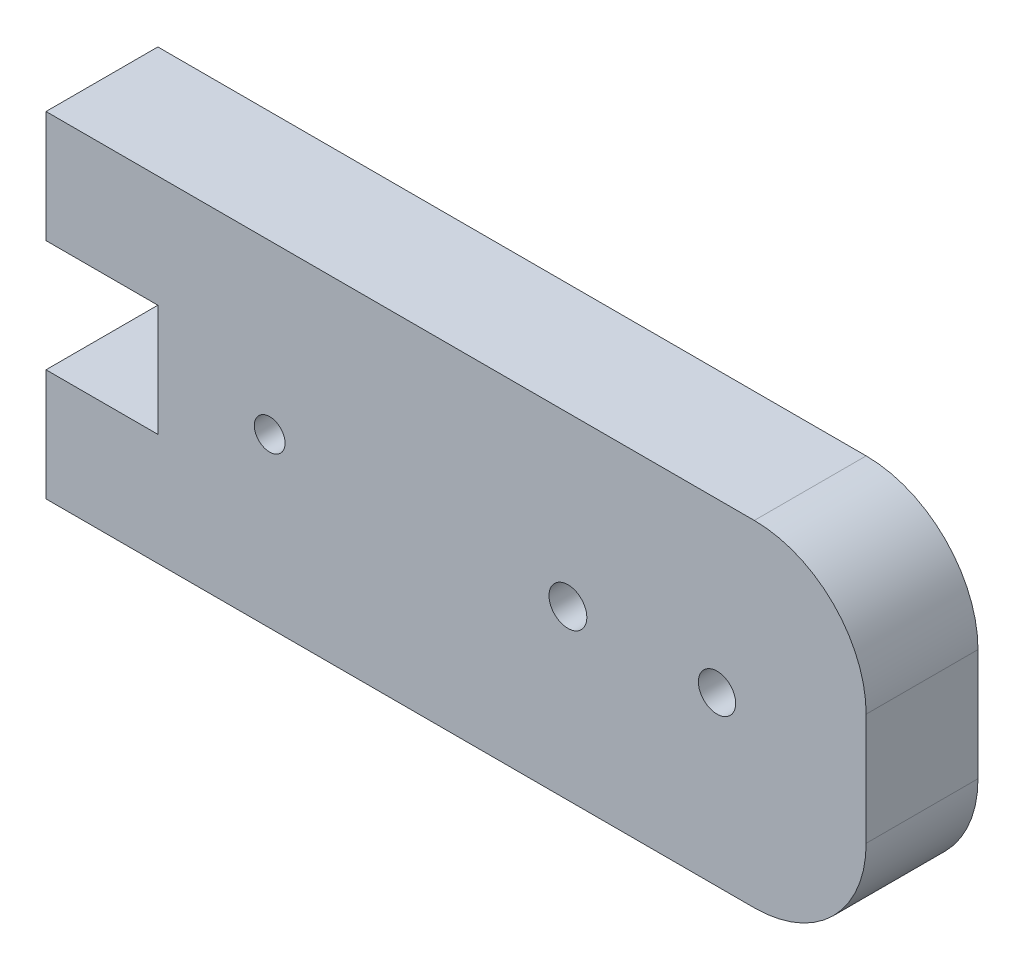
ISO-10303-21;
HEADER;
FILE_DESCRIPTION(('STEP AP214'),'2;1');
FILE_NAME('part.step','',(''),(''),'','','');
FILE_SCHEMA(('AUTOMOTIVE_DESIGN { 1 0 10303 214 1 1 1 1 }'));
ENDSEC;
DATA;
#1=APPLICATION_CONTEXT('core data for automotive mechanical design processes');
#2=APPLICATION_PROTOCOL_DEFINITION('international standard','automotive_design',2000,#1);
#3=PRODUCT_CONTEXT('',#1,'mechanical');
#4=PRODUCT('Part','Part','',(#3));
#5=PRODUCT_RELATED_PRODUCT_CATEGORY('part','',(#4));
#6=PRODUCT_DEFINITION_FORMATION('','',#4);
#7=PRODUCT_DEFINITION_CONTEXT('part definition',#1,'design');
#8=PRODUCT_DEFINITION('design','',#6,#7);
#9=PRODUCT_DEFINITION_SHAPE('','',#8);
#10=(LENGTH_UNIT() NAMED_UNIT(*) SI_UNIT(.MILLI.,.METRE.));
#11=(NAMED_UNIT(*) PLANE_ANGLE_UNIT() SI_UNIT($,.RADIAN.));
#12=(NAMED_UNIT(*) SI_UNIT($,.STERADIAN.) SOLID_ANGLE_UNIT());
#13=UNCERTAINTY_MEASURE_WITH_UNIT(LENGTH_MEASURE(1.E-05),#10,'distance_accuracy_value','');
#14=(GEOMETRIC_REPRESENTATION_CONTEXT(3) GLOBAL_UNCERTAINTY_ASSIGNED_CONTEXT((#13)) GLOBAL_UNIT_ASSIGNED_CONTEXT((#10,
#11,#12)) REPRESENTATION_CONTEXT('',''));
#15=CARTESIAN_POINT('',(0.,0.,0.));
#16=DIRECTION('',(0.,0.,1.));
#17=DIRECTION('',(1.,0.,0.));
#18=AXIS2_PLACEMENT_3D('',#15,#16,#17);
#19=CARTESIAN_POINT('',(0.,0.,3.));
#20=DIRECTION('',(0.,0.,1.));
#21=DIRECTION('',(1.,0.,0.));
#22=AXIS2_PLACEMENT_3D('',#19,#20,#21);
#23=PLANE('',#22);
#24=CARTESIAN_POINT('',(-5.,0.,3.));
#25=DIRECTION('',(0.,0.,1.));
#26=DIRECTION('',(1.,0.,0.));
#27=AXIS2_PLACEMENT_3D('',#24,#25,#26);
#28=CIRCLE('',#27,0.412242994607637);
#29=CARTESIAN_POINT('',(-4.58775700539236,0.,3.));
#30=VERTEX_POINT('',#29);
#31=EDGE_CURVE('E363',#30,#30,#28,.T.);
#32=ORIENTED_EDGE('',*,*,#31,.F.);
#33=EDGE_LOOP('',(#32));
#34=FACE_BOUND('',#33,.T.);
#35=DIRECTION('',(1.,0.,0.));
#36=VECTOR('',#35,1.);
#37=CARTESIAN_POINT('',(-11.,-4.5,3.));
#38=LINE('',#37,#36);
#39=CARTESIAN_POINT('',(-11.,-4.5,3.));
#40=VERTEX_POINT('',#39);
#41=CARTESIAN_POINT('',(8.,-4.5,3.));
#42=VERTEX_POINT('',#41);
#43=EDGE_CURVE('E144',#40,#42,#38,.T.);
#44=ORIENTED_EDGE('',*,*,#43,.T.);
#45=CARTESIAN_POINT('',(8.,-1.5,3.));
#46=DIRECTION('',(0.,0.,1.));
#47=DIRECTION('',(1.,0.,0.));
#48=AXIS2_PLACEMENT_3D('',#45,#46,#47);
#49=CIRCLE('',#48,3.);
#50=CARTESIAN_POINT('',(11.,-1.5,3.));
#51=VERTEX_POINT('',#50);
#52=EDGE_CURVE('E41',#42,#51,#49,.T.);
#53=ORIENTED_EDGE('',*,*,#52,.T.);
#54=DIRECTION('',(0.,1.,0.));
#55=VECTOR('',#54,1.);
#56=CARTESIAN_POINT('',(11.,-0.499999999999999,3.));
#57=LINE('',#56,#55);
#58=CARTESIAN_POINT('',(11.,1.5,3.));
#59=VERTEX_POINT('',#58);
#60=EDGE_CURVE('E118',#51,#59,#57,.T.);
#61=ORIENTED_EDGE('',*,*,#60,.T.);
#62=CARTESIAN_POINT('',(8.,1.5,3.));
#63=DIRECTION('',(0.,0.,1.));
#64=DIRECTION('',(1.,0.,0.));
#65=AXIS2_PLACEMENT_3D('',#62,#63,#64);
#66=CIRCLE('',#65,3.);
#67=CARTESIAN_POINT('',(8.,4.5,3.));
#68=VERTEX_POINT('',#67);
#69=EDGE_CURVE('E48',#59,#68,#66,.T.);
#70=ORIENTED_EDGE('',*,*,#69,.T.);
#71=DIRECTION('',(-1.,0.,0.));
#72=VECTOR('',#71,1.);
#73=CARTESIAN_POINT('',(-11.,4.5,3.));
#74=LINE('',#73,#72);
#75=CARTESIAN_POINT('',(-11.,4.5,3.));
#76=VERTEX_POINT('',#75);
#77=EDGE_CURVE('E110',#68,#76,#74,.T.);
#78=ORIENTED_EDGE('',*,*,#77,.T.);
#79=DIRECTION('',(0.,-1.,0.));
#80=VECTOR('',#79,1.);
#81=CARTESIAN_POINT('',(-11.,4.5,3.));
#82=LINE('',#81,#80);
#83=CARTESIAN_POINT('',(-11.,1.5,3.));
#84=VERTEX_POINT('',#83);
#85=EDGE_CURVE('E114',#76,#84,#82,.T.);
#86=ORIENTED_EDGE('',*,*,#85,.T.);
#87=DIRECTION('',(1.,0.,0.));
#88=VECTOR('',#87,1.);
#89=CARTESIAN_POINT('',(-11.,1.5,3.));
#90=LINE('',#89,#88);
#91=CARTESIAN_POINT('',(-8.,1.5,3.));
#92=VERTEX_POINT('',#91);
#93=EDGE_CURVE('E133',#84,#92,#90,.T.);
#94=ORIENTED_EDGE('',*,*,#93,.T.);
#95=DIRECTION('',(0.,-1.,0.));
#96=VECTOR('',#95,1.);
#97=CARTESIAN_POINT('',(-8.,1.5,3.));
#98=LINE('',#97,#96);
#99=CARTESIAN_POINT('',(-8.,-1.5,3.));
#100=VERTEX_POINT('',#99);
#101=EDGE_CURVE('E135',#92,#100,#98,.T.);
#102=ORIENTED_EDGE('',*,*,#101,.T.);
#103=DIRECTION('',(-1.,0.,0.));
#104=VECTOR('',#103,1.);
#105=CARTESIAN_POINT('',(-11.,-1.5,3.));
#106=LINE('',#105,#104);
#107=CARTESIAN_POINT('',(-11.,-1.5,3.));
#108=VERTEX_POINT('',#107);
#109=EDGE_CURVE('E140',#100,#108,#106,.T.);
#110=ORIENTED_EDGE('',*,*,#109,.T.);
#111=DIRECTION('',(0.,-1.,0.));
#112=VECTOR('',#111,1.);
#113=CARTESIAN_POINT('',(-11.,-1.5,3.));
#114=LINE('',#113,#112);
#115=EDGE_CURVE('E142',#108,#40,#114,.T.);
#116=ORIENTED_EDGE('',*,*,#115,.T.);
#117=EDGE_LOOP('',(#44,#53,#61,#70,#78,#86,#94,#102,#110,#116));
#118=FACE_BOUND('',#117,.T.);
#119=CARTESIAN_POINT('',(3.,0.,3.));
#120=DIRECTION('',(0.,0.,1.));
#121=DIRECTION('',(1.,0.,0.));
#122=AXIS2_PLACEMENT_3D('',#119,#120,#121);
#123=CIRCLE('',#122,0.507316736071191);
#124=CARTESIAN_POINT('',(3.50731673607119,0.,3.));
#125=VERTEX_POINT('',#124);
#126=EDGE_CURVE('E150',#125,#125,#123,.T.);
#127=ORIENTED_EDGE('',*,*,#126,.F.);
#128=EDGE_LOOP('',(#127));
#129=FACE_BOUND('',#128,.T.);
#130=CARTESIAN_POINT('',(7.,0.,3.));
#131=DIRECTION('',(0.,0.,1.));
#132=DIRECTION('',(1.,0.,0.));
#133=AXIS2_PLACEMENT_3D('',#130,#131,#132);
#134=CIRCLE('',#133,0.500000000000001);
#135=CARTESIAN_POINT('',(7.5,0.,3.));
#136=VERTEX_POINT('',#135);
#137=EDGE_CURVE('E354',#136,#136,#134,.T.);
#138=ORIENTED_EDGE('',*,*,#137,.F.);
#139=EDGE_LOOP('',(#138));
#140=FACE_BOUND('',#139,.T.);
#141=ADVANCED_FACE('F33',(#34,#118,#129,#140),#23,.T.);
#142=CARTESIAN_POINT('',(0.,0.,0.));
#143=DIRECTION('',(0.,0.,1.));
#144=DIRECTION('',(1.,0.,0.));
#145=AXIS2_PLACEMENT_3D('',#142,#143,#144);
#146=PLANE('',#145);
#147=DIRECTION('',(0.,1.,0.));
#148=VECTOR('',#147,1.);
#149=CARTESIAN_POINT('',(11.,4.5,0.));
#150=LINE('',#149,#148);
#151=CARTESIAN_POINT('',(11.,-1.5,0.));
#152=VERTEX_POINT('',#151);
#153=CARTESIAN_POINT('',(11.,1.5,0.));
#154=VERTEX_POINT('',#153);
#155=EDGE_CURVE('E147',#152,#154,#150,.T.);
#156=ORIENTED_EDGE('',*,*,#155,.F.);
#157=CARTESIAN_POINT('',(8.,-1.5,0.));
#158=DIRECTION('',(0.,0.,1.));
#159=DIRECTION('',(1.,0.,0.));
#160=AXIS2_PLACEMENT_3D('',#157,#158,#159);
#161=CIRCLE('',#160,3.);
#162=CARTESIAN_POINT('',(8.,-4.5,0.));
#163=VERTEX_POINT('',#162);
#164=EDGE_CURVE('E182',#152,#163,#161,.F.);
#165=ORIENTED_EDGE('',*,*,#164,.T.);
#166=DIRECTION('',(1.,0.,0.));
#167=VECTOR('',#166,1.);
#168=CARTESIAN_POINT('',(-11.,-4.5,0.));
#169=LINE('',#168,#167);
#170=CARTESIAN_POINT('',(-11.,-4.5,0.));
#171=VERTEX_POINT('',#170);
#172=EDGE_CURVE('E162',#171,#163,#169,.T.);
#173=ORIENTED_EDGE('',*,*,#172,.F.);
#174=DIRECTION('',(0.,-1.,0.));
#175=VECTOR('',#174,1.);
#176=CARTESIAN_POINT('',(-11.,-1.5,0.));
#177=LINE('',#176,#175);
#178=CARTESIAN_POINT('',(-11.,-1.5,0.));
#179=VERTEX_POINT('',#178);
#180=EDGE_CURVE('E160',#179,#171,#177,.T.);
#181=ORIENTED_EDGE('',*,*,#180,.F.);
#182=DIRECTION('',(-1.,0.,0.));
#183=VECTOR('',#182,1.);
#184=CARTESIAN_POINT('',(-11.,-1.5,0.));
#185=LINE('',#184,#183);
#186=CARTESIAN_POINT('',(-8.,-1.5,0.));
#187=VERTEX_POINT('',#186);
#188=EDGE_CURVE('E158',#187,#179,#185,.T.);
#189=ORIENTED_EDGE('',*,*,#188,.F.);
#190=DIRECTION('',(0.,-1.,0.));
#191=VECTOR('',#190,1.);
#192=CARTESIAN_POINT('',(-8.,1.5,0.));
#193=LINE('',#192,#191);
#194=CARTESIAN_POINT('',(-8.,1.5,0.));
#195=VERTEX_POINT('',#194);
#196=EDGE_CURVE('E156',#195,#187,#193,.T.);
#197=ORIENTED_EDGE('',*,*,#196,.F.);
#198=DIRECTION('',(1.,0.,0.));
#199=VECTOR('',#198,1.);
#200=CARTESIAN_POINT('',(-11.,1.5,0.));
#201=LINE('',#200,#199);
#202=CARTESIAN_POINT('',(-11.,1.5,0.));
#203=VERTEX_POINT('',#202);
#204=EDGE_CURVE('E154',#203,#195,#201,.T.);
#205=ORIENTED_EDGE('',*,*,#204,.F.);
#206=DIRECTION('',(0.,-1.,0.));
#207=VECTOR('',#206,1.);
#208=CARTESIAN_POINT('',(-11.,4.5,0.));
#209=LINE('',#208,#207);
#210=CARTESIAN_POINT('',(-11.,4.5,0.));
#211=VERTEX_POINT('',#210);
#212=EDGE_CURVE('E152',#211,#203,#209,.T.);
#213=ORIENTED_EDGE('',*,*,#212,.F.);
#214=DIRECTION('',(-1.,0.,0.));
#215=VECTOR('',#214,1.);
#216=CARTESIAN_POINT('',(-11.,4.5,0.));
#217=LINE('',#216,#215);
#218=CARTESIAN_POINT('',(8.,4.5,0.));
#219=VERTEX_POINT('',#218);
#220=EDGE_CURVE('E124',#219,#211,#217,.T.);
#221=ORIENTED_EDGE('',*,*,#220,.F.);
#222=CARTESIAN_POINT('',(8.,1.5,0.));
#223=DIRECTION('',(0.,0.,1.));
#224=DIRECTION('',(1.,0.,0.));
#225=AXIS2_PLACEMENT_3D('',#222,#223,#224);
#226=CIRCLE('',#225,3.);
#227=EDGE_CURVE('E180',#219,#154,#226,.F.);
#228=ORIENTED_EDGE('',*,*,#227,.T.);
#229=EDGE_LOOP('',(#156,#165,#173,#181,#189,#197,#205,#213,#221,#228));
#230=FACE_BOUND('',#229,.T.);
#231=CARTESIAN_POINT('',(3.,0.,0.));
#232=DIRECTION('',(0.,0.,1.));
#233=DIRECTION('',(1.,0.,0.));
#234=AXIS2_PLACEMENT_3D('',#231,#232,#233);
#235=CIRCLE('',#234,0.507316736071191);
#236=CARTESIAN_POINT('',(3.50731673607119,0.,0.));
#237=VERTEX_POINT('',#236);
#238=EDGE_CURVE('E366',#237,#237,#235,.T.);
#239=ORIENTED_EDGE('',*,*,#238,.T.);
#240=EDGE_LOOP('',(#239));
#241=FACE_BOUND('',#240,.T.);
#242=CARTESIAN_POINT('',(-5.,0.,0.));
#243=DIRECTION('',(0.,0.,1.));
#244=DIRECTION('',(1.,0.,0.));
#245=AXIS2_PLACEMENT_3D('',#242,#243,#244);
#246=CIRCLE('',#245,0.412242994607637);
#247=CARTESIAN_POINT('',(-4.58775700539236,0.,0.));
#248=VERTEX_POINT('',#247);
#249=EDGE_CURVE('E360',#248,#248,#246,.T.);
#250=ORIENTED_EDGE('',*,*,#249,.T.);
#251=EDGE_LOOP('',(#250));
#252=FACE_BOUND('',#251,.T.);
#253=CARTESIAN_POINT('',(7.,0.,0.));
#254=DIRECTION('',(0.,0.,1.));
#255=DIRECTION('',(1.,0.,0.));
#256=AXIS2_PLACEMENT_3D('',#253,#254,#255);
#257=CIRCLE('',#256,0.500000000000001);
#258=CARTESIAN_POINT('',(7.5,0.,0.));
#259=VERTEX_POINT('',#258);
#260=EDGE_CURVE('E357',#259,#259,#257,.T.);
#261=ORIENTED_EDGE('',*,*,#260,.T.);
#262=EDGE_LOOP('',(#261));
#263=FACE_BOUND('',#262,.T.);
#264=ADVANCED_FACE('F196',(#230,#241,#252,#263),#146,.F.);
#265=CARTESIAN_POINT('',(11.,4.5,3.));
#266=DIRECTION('',(-1.,0.,0.));
#267=DIRECTION('',(0.,0.,1.));
#268=AXIS2_PLACEMENT_3D('',#265,#266,#267);
#269=PLANE('',#268);
#270=ORIENTED_EDGE('',*,*,#60,.F.);
#271=DIRECTION('',(0.,0.,-1.));
#272=VECTOR('',#271,1.);
#273=CARTESIAN_POINT('',(11.,-1.5,3.));
#274=LINE('',#273,#272);
#275=EDGE_CURVE('E177',#51,#152,#274,.T.);
#276=ORIENTED_EDGE('',*,*,#275,.T.);
#277=ORIENTED_EDGE('',*,*,#155,.T.);
#278=DIRECTION('',(0.,0.,-1.));
#279=VECTOR('',#278,1.);
#280=CARTESIAN_POINT('',(11.,1.5,3.));
#281=LINE('',#280,#279);
#282=EDGE_CURVE('E127',#154,#59,#281,.F.);
#283=ORIENTED_EDGE('',*,*,#282,.T.);
#284=EDGE_LOOP('',(#270,#276,#277,#283));
#285=FACE_BOUND('',#284,.T.);
#286=ADVANCED_FACE('F190',(#285),#269,.F.);
#287=CARTESIAN_POINT('',(-11.,4.5,3.));
#288=DIRECTION('',(0.,-1.,0.));
#289=DIRECTION('',(0.,0.,-1.));
#290=AXIS2_PLACEMENT_3D('',#287,#288,#289);
#291=PLANE('',#290);
#292=ORIENTED_EDGE('',*,*,#77,.F.);
#293=DIRECTION('',(0.,0.,-1.));
#294=VECTOR('',#293,1.);
#295=CARTESIAN_POINT('',(8.,4.5,3.));
#296=LINE('',#295,#294);
#297=EDGE_CURVE('E11',#68,#219,#296,.T.);
#298=ORIENTED_EDGE('',*,*,#297,.T.);
#299=ORIENTED_EDGE('',*,*,#220,.T.);
#300=DIRECTION('',(0.,0.,-1.));
#301=VECTOR('',#300,1.);
#302=CARTESIAN_POINT('',(-11.,4.5,3.));
#303=LINE('',#302,#301);
#304=EDGE_CURVE('E121',#76,#211,#303,.T.);
#305=ORIENTED_EDGE('',*,*,#304,.F.);
#306=EDGE_LOOP('',(#292,#298,#299,#305));
#307=FACE_BOUND('',#306,.T.);
#308=ADVANCED_FACE('F122',(#307),#291,.F.);
#309=CARTESIAN_POINT('',(-11.,4.5,3.));
#310=DIRECTION('',(1.,0.,0.));
#311=DIRECTION('',(0.,0.,-1.));
#312=AXIS2_PLACEMENT_3D('',#309,#310,#311);
#313=PLANE('',#312);
#314=ORIENTED_EDGE('',*,*,#212,.T.);
#315=DIRECTION('',(0.,0.,-1.));
#316=VECTOR('',#315,1.);
#317=CARTESIAN_POINT('',(-11.,1.5,3.));
#318=LINE('',#317,#316);
#319=EDGE_CURVE('E128',#84,#203,#318,.T.);
#320=ORIENTED_EDGE('',*,*,#319,.F.);
#321=ORIENTED_EDGE('',*,*,#85,.F.);
#322=ORIENTED_EDGE('',*,*,#304,.T.);
#323=EDGE_LOOP('',(#314,#320,#321,#322));
#324=FACE_BOUND('',#323,.T.);
#325=ADVANCED_FACE('F130',(#324),#313,.F.);
#326=CARTESIAN_POINT('',(-11.,1.5,3.));
#327=DIRECTION('',(0.,1.,0.));
#328=DIRECTION('',(0.,0.,1.));
#329=AXIS2_PLACEMENT_3D('',#326,#327,#328);
#330=PLANE('',#329);
#331=ORIENTED_EDGE('',*,*,#204,.T.);
#332=DIRECTION('',(0.,0.,-1.));
#333=VECTOR('',#332,1.);
#334=CARTESIAN_POINT('',(-8.,1.5,3.));
#335=LINE('',#334,#333);
#336=EDGE_CURVE('E172',#92,#195,#335,.T.);
#337=ORIENTED_EDGE('',*,*,#336,.F.);
#338=ORIENTED_EDGE('',*,*,#93,.F.);
#339=ORIENTED_EDGE('',*,*,#319,.T.);
#340=EDGE_LOOP('',(#331,#337,#338,#339));
#341=FACE_BOUND('',#340,.T.);
#342=ADVANCED_FACE('F217',(#341),#330,.F.);
#343=CARTESIAN_POINT('',(-8.,1.5,3.));
#344=DIRECTION('',(1.,0.,0.));
#345=DIRECTION('',(0.,0.,-1.));
#346=AXIS2_PLACEMENT_3D('',#343,#344,#345);
#347=PLANE('',#346);
#348=ORIENTED_EDGE('',*,*,#196,.T.);
#349=DIRECTION('',(0.,0.,-1.));
#350=VECTOR('',#349,1.);
#351=CARTESIAN_POINT('',(-8.,-1.5,3.));
#352=LINE('',#351,#350);
#353=EDGE_CURVE('E169',#100,#187,#352,.T.);
#354=ORIENTED_EDGE('',*,*,#353,.F.);
#355=ORIENTED_EDGE('',*,*,#101,.F.);
#356=ORIENTED_EDGE('',*,*,#336,.T.);
#357=EDGE_LOOP('',(#348,#354,#355,#356));
#358=FACE_BOUND('',#357,.T.);
#359=ADVANCED_FACE('F214',(#358),#347,.F.);
#360=CARTESIAN_POINT('',(-11.,-1.5,3.));
#361=DIRECTION('',(0.,-1.,0.));
#362=DIRECTION('',(0.,0.,-1.));
#363=AXIS2_PLACEMENT_3D('',#360,#361,#362);
#364=PLANE('',#363);
#365=ORIENTED_EDGE('',*,*,#188,.T.);
#366=DIRECTION('',(0.,0.,-1.));
#367=VECTOR('',#366,1.);
#368=CARTESIAN_POINT('',(-11.,-1.5,3.));
#369=LINE('',#368,#367);
#370=EDGE_CURVE('E166',#108,#179,#369,.T.);
#371=ORIENTED_EDGE('',*,*,#370,.F.);
#372=ORIENTED_EDGE('',*,*,#109,.F.);
#373=ORIENTED_EDGE('',*,*,#353,.T.);
#374=EDGE_LOOP('',(#365,#371,#372,#373));
#375=FACE_BOUND('',#374,.T.);
#376=ADVANCED_FACE('F209',(#375),#364,.F.);
#377=CARTESIAN_POINT('',(-11.,-1.5,3.));
#378=DIRECTION('',(1.,0.,0.));
#379=DIRECTION('',(0.,0.,-1.));
#380=AXIS2_PLACEMENT_3D('',#377,#378,#379);
#381=PLANE('',#380);
#382=ORIENTED_EDGE('',*,*,#180,.T.);
#383=DIRECTION('',(0.,0.,-1.));
#384=VECTOR('',#383,1.);
#385=CARTESIAN_POINT('',(-11.,-4.5,3.));
#386=LINE('',#385,#384);
#387=EDGE_CURVE('E146',#40,#171,#386,.T.);
#388=ORIENTED_EDGE('',*,*,#387,.F.);
#389=ORIENTED_EDGE('',*,*,#115,.F.);
#390=ORIENTED_EDGE('',*,*,#370,.T.);
#391=EDGE_LOOP('',(#382,#388,#389,#390));
#392=FACE_BOUND('',#391,.T.);
#393=ADVANCED_FACE('F203',(#392),#381,.F.);
#394=CARTESIAN_POINT('',(-11.,-4.5,3.));
#395=DIRECTION('',(0.,1.,0.));
#396=DIRECTION('',(0.,0.,1.));
#397=AXIS2_PLACEMENT_3D('',#394,#395,#396);
#398=PLANE('',#397);
#399=ORIENTED_EDGE('',*,*,#172,.T.);
#400=DIRECTION('',(0.,0.,-1.));
#401=VECTOR('',#400,1.);
#402=CARTESIAN_POINT('',(8.,-4.5,3.));
#403=LINE('',#402,#401);
#404=EDGE_CURVE('E56',#163,#42,#403,.F.);
#405=ORIENTED_EDGE('',*,*,#404,.T.);
#406=ORIENTED_EDGE('',*,*,#43,.F.);
#407=ORIENTED_EDGE('',*,*,#387,.T.);
#408=EDGE_LOOP('',(#399,#405,#406,#407));
#409=FACE_BOUND('',#408,.T.);
#410=ADVANCED_FACE('F199',(#409),#398,.F.);
#411=CARTESIAN_POINT('',(3.,0.,3.));
#412=DIRECTION('',(0.,0.,-1.));
#413=DIRECTION('',(-1.,0.,0.));
#414=AXIS2_PLACEMENT_3D('',#411,#412,#413);
#415=CYLINDRICAL_SURFACE('',#414,0.507316736071191);
#416=ORIENTED_EDGE('',*,*,#126,.T.);
#417=EDGE_LOOP('',(#416));
#418=FACE_BOUND('',#417,.T.);
#419=ORIENTED_EDGE('',*,*,#238,.F.);
#420=EDGE_LOOP('',(#419));
#421=FACE_BOUND('',#420,.T.);
#422=ADVANCED_FACE('F233',(#418,#421),#415,.F.);
#423=CARTESIAN_POINT('',(-5.,0.,3.));
#424=DIRECTION('',(0.,0.,-1.));
#425=DIRECTION('',(-1.,0.,0.));
#426=AXIS2_PLACEMENT_3D('',#423,#424,#425);
#427=CYLINDRICAL_SURFACE('',#426,0.412242994607637);
#428=ORIENTED_EDGE('',*,*,#31,.T.);
#429=EDGE_LOOP('',(#428));
#430=FACE_BOUND('',#429,.T.);
#431=ORIENTED_EDGE('',*,*,#249,.F.);
#432=EDGE_LOOP('',(#431));
#433=FACE_BOUND('',#432,.T.);
#434=ADVANCED_FACE('F290',(#430,#433),#427,.F.);
#435=CARTESIAN_POINT('',(7.,0.,3.));
#436=DIRECTION('',(0.,0.,-1.));
#437=DIRECTION('',(-1.,0.,0.));
#438=AXIS2_PLACEMENT_3D('',#435,#436,#437);
#439=CYLINDRICAL_SURFACE('',#438,0.500000000000001);
#440=ORIENTED_EDGE('',*,*,#137,.T.);
#441=EDGE_LOOP('',(#440));
#442=FACE_BOUND('',#441,.T.);
#443=ORIENTED_EDGE('',*,*,#260,.F.);
#444=EDGE_LOOP('',(#443));
#445=FACE_BOUND('',#444,.T.);
#446=ADVANCED_FACE('F223',(#442,#445),#439,.F.);
#447=CARTESIAN_POINT('',(8.,-1.5,3.));
#448=DIRECTION('',(0.,0.,-1.));
#449=DIRECTION('',(-1.,0.,0.));
#450=AXIS2_PLACEMENT_3D('',#447,#448,#449);
#451=CYLINDRICAL_SURFACE('',#450,3.);
#452=ORIENTED_EDGE('',*,*,#52,.F.);
#453=ORIENTED_EDGE('',*,*,#404,.F.);
#454=ORIENTED_EDGE('',*,*,#164,.F.);
#455=ORIENTED_EDGE('',*,*,#275,.F.);
#456=EDGE_LOOP('',(#452,#453,#454,#455));
#457=FACE_BOUND('',#456,.T.);
#458=ADVANCED_FACE('F193',(#457),#451,.T.);
#459=CARTESIAN_POINT('',(8.,1.5,3.));
#460=DIRECTION('',(0.,0.,-1.));
#461=DIRECTION('',(-1.,0.,0.));
#462=AXIS2_PLACEMENT_3D('',#459,#460,#461);
#463=CYLINDRICAL_SURFACE('',#462,3.);
#464=ORIENTED_EDGE('',*,*,#69,.F.);
#465=ORIENTED_EDGE('',*,*,#282,.F.);
#466=ORIENTED_EDGE('',*,*,#227,.F.);
#467=ORIENTED_EDGE('',*,*,#297,.F.);
#468=EDGE_LOOP('',(#464,#465,#466,#467));
#469=FACE_BOUND('',#468,.T.);
#470=ADVANCED_FACE('F35',(#469),#463,.T.);
#471=CLOSED_SHELL('',(#141,#264,#286,#308,#325,#342,#359,#376,#393,#410,#422,#434,#446,#458,#470));
#472=MANIFOLD_SOLID_BREP('B2',#471);
#473=ADVANCED_BREP_SHAPE_REPRESENTATION('',(#18,#472),#14);
#474=SHAPE_DEFINITION_REPRESENTATION(#9,#473);
ENDSEC;
END-ISO-10303-21;
